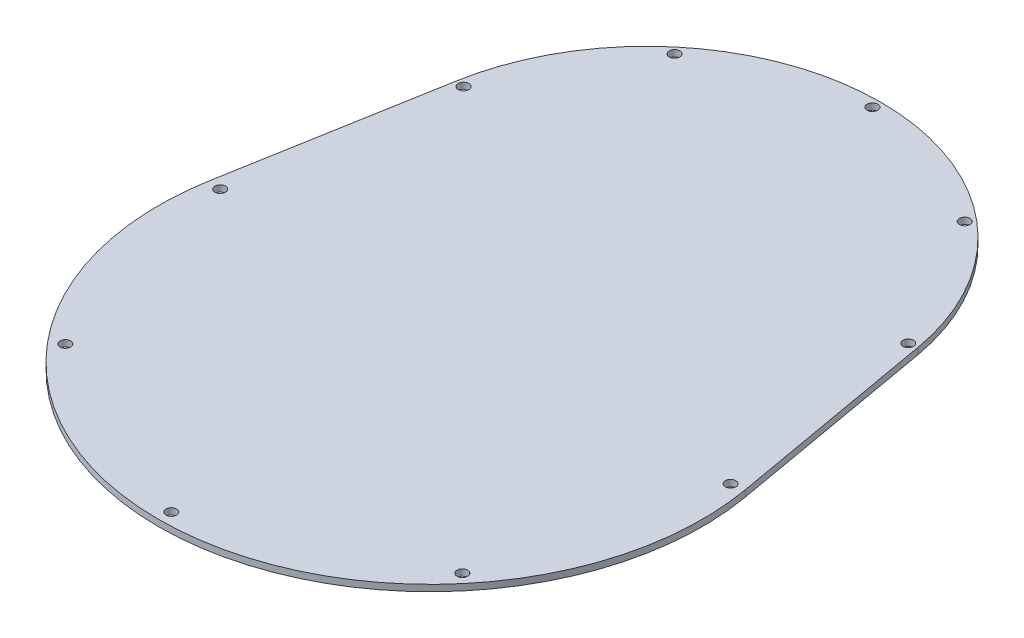
ISO-10303-21;
HEADER;
FILE_DESCRIPTION(('STEP AP214'),'2;1');
FILE_NAME('part.step','',(''),(''),'','','');
FILE_SCHEMA(('AUTOMOTIVE_DESIGN { 1 0 10303 214 1 1 1 1 }'));
ENDSEC;
DATA;
#1=APPLICATION_CONTEXT('core data for automotive mechanical design processes');
#2=APPLICATION_PROTOCOL_DEFINITION('international standard','automotive_design',2000,#1);
#3=PRODUCT_CONTEXT('',#1,'mechanical');
#4=PRODUCT('Part','Part','',(#3));
#5=PRODUCT_RELATED_PRODUCT_CATEGORY('part','',(#4));
#6=PRODUCT_DEFINITION_FORMATION('','',#4);
#7=PRODUCT_DEFINITION_CONTEXT('part definition',#1,'design');
#8=PRODUCT_DEFINITION('design','',#6,#7);
#9=PRODUCT_DEFINITION_SHAPE('','',#8);
#10=(LENGTH_UNIT() NAMED_UNIT(*) SI_UNIT(.MILLI.,.METRE.));
#11=(NAMED_UNIT(*) PLANE_ANGLE_UNIT() SI_UNIT($,.RADIAN.));
#12=(NAMED_UNIT(*) SI_UNIT($,.STERADIAN.) SOLID_ANGLE_UNIT());
#13=UNCERTAINTY_MEASURE_WITH_UNIT(LENGTH_MEASURE(1.E-05),#10,'distance_accuracy_value','');
#14=(GEOMETRIC_REPRESENTATION_CONTEXT(3) GLOBAL_UNCERTAINTY_ASSIGNED_CONTEXT((#13)) GLOBAL_UNIT_ASSIGNED_CONTEXT((#10,
#11,#12)) REPRESENTATION_CONTEXT('',''));
#15=CARTESIAN_POINT('',(0.,0.,0.));
#16=DIRECTION('',(0.,0.,1.));
#17=DIRECTION('',(1.,0.,0.));
#18=AXIS2_PLACEMENT_3D('',#15,#16,#17);
#19=CARTESIAN_POINT('',(0.,-3.,101.542661188575));
#20=DIRECTION('',(0.,1.,0.));
#21=DIRECTION('',(0.,0.,1.));
#22=AXIS2_PLACEMENT_3D('',#19,#20,#21);
#23=CYLINDRICAL_SURFACE('',#22,127.632698070846);
#24=CARTESIAN_POINT('',(0.,0.,101.542661188575));
#25=DIRECTION('',(0.,1.,0.));
#26=DIRECTION('',(0.,0.,1.));
#27=AXIS2_PLACEMENT_3D('',#24,#25,#26);
#28=CIRCLE('',#27,127.632698070846);
#29=CARTESIAN_POINT('',(-125.693670598036,0.,79.379475757859));
#30=VERTEX_POINT('',#29);
#31=CARTESIAN_POINT('',(125.693670598036,0.,79.3794757578591));
#32=VERTEX_POINT('',#31);
#33=EDGE_CURVE('E106',#30,#32,#28,.T.);
#34=ORIENTED_EDGE('',*,*,#33,.F.);
#35=DIRECTION('',(0.,1.,0.));
#36=VECTOR('',#35,1.);
#37=CARTESIAN_POINT('',(-125.693670598036,-3.,79.379475757859));
#38=LINE('',#37,#36);
#39=CARTESIAN_POINT('',(-125.693670598036,-3.,79.379475757859));
#40=VERTEX_POINT('',#39);
#41=EDGE_CURVE('E11',#40,#30,#38,.T.);
#42=ORIENTED_EDGE('',*,*,#41,.F.);
#43=CARTESIAN_POINT('',(0.,-3.,101.542661188575));
#44=DIRECTION('',(0.,1.,0.));
#45=DIRECTION('',(0.,0.,1.));
#46=AXIS2_PLACEMENT_3D('',#43,#44,#45);
#47=CIRCLE('',#46,127.632698070846);
#48=CARTESIAN_POINT('',(125.693670598036,-3.,79.3794757578591));
#49=VERTEX_POINT('',#48);
#50=EDGE_CURVE('E99',#40,#49,#47,.T.);
#51=ORIENTED_EDGE('',*,*,#50,.T.);
#52=DIRECTION('',(0.,1.,0.));
#53=VECTOR('',#52,1.);
#54=CARTESIAN_POINT('',(125.693670598036,-3.,79.3794757578591));
#55=LINE('',#54,#53);
#56=EDGE_CURVE('E44',#49,#32,#55,.T.);
#57=ORIENTED_EDGE('',*,*,#56,.T.);
#58=EDGE_LOOP('',(#34,#42,#51,#57));
#59=FACE_BOUND('',#58,.T.);
#60=ADVANCED_FACE('F41',(#59),#23,.T.);
#61=CARTESIAN_POINT('',(-108.328852831343,-3.,-19.101299543362));
#62=DIRECTION('',(-0.984807753012209,0.,-0.173648177666927));
#63=DIRECTION('',(-0.173648177666927,0.,0.984807753012209));
#64=AXIS2_PLACEMENT_3D('',#61,#62,#63);
#65=PLANE('',#64);
#66=DIRECTION('',(-0.173648177666927,0.,0.984807753012209));
#67=VECTOR('',#66,1.);
#68=CARTESIAN_POINT('',(-108.328852831343,0.,-19.101299543362));
#69=LINE('',#68,#67);
#70=CARTESIAN_POINT('',(-108.328852831343,0.,-19.101299543362));
#71=VERTEX_POINT('',#70);
#72=EDGE_CURVE('E101',#71,#30,#69,.T.);
#73=ORIENTED_EDGE('',*,*,#72,.F.);
#74=DIRECTION('',(0.,1.,0.));
#75=VECTOR('',#74,1.);
#76=CARTESIAN_POINT('',(-108.328852831343,-3.,-19.101299543362));
#77=LINE('',#76,#75);
#78=CARTESIAN_POINT('',(-108.328852831343,-3.,-19.101299543362));
#79=VERTEX_POINT('',#78);
#80=EDGE_CURVE('E50',#79,#71,#77,.T.);
#81=ORIENTED_EDGE('',*,*,#80,.F.);
#82=DIRECTION('',(-0.173648177666927,0.,0.984807753012209));
#83=VECTOR('',#82,1.);
#84=CARTESIAN_POINT('',(-108.328852831343,-3.,-19.101299543362));
#85=LINE('',#84,#83);
#86=EDGE_CURVE('E96',#79,#40,#85,.T.);
#87=ORIENTED_EDGE('',*,*,#86,.T.);
#88=ORIENTED_EDGE('',*,*,#41,.T.);
#89=EDGE_LOOP('',(#73,#81,#87,#88));
#90=FACE_BOUND('',#89,.T.);
#91=ADVANCED_FACE('F117',(#90),#65,.T.);
#92=CARTESIAN_POINT('',(0.,-3.,0.));
#93=DIRECTION('',(0.,1.,0.));
#94=DIRECTION('',(0.,0.,1.));
#95=AXIS2_PLACEMENT_3D('',#92,#93,#94);
#96=CYLINDRICAL_SURFACE('',#95,110.);
#97=CARTESIAN_POINT('',(0.,0.,0.));
#98=DIRECTION('',(0.,1.,0.));
#99=DIRECTION('',(0.,0.,1.));
#100=AXIS2_PLACEMENT_3D('',#97,#98,#99);
#101=CIRCLE('',#100,110.);
#102=CARTESIAN_POINT('',(108.328852831343,0.,-19.101299543362));
#103=VERTEX_POINT('',#102);
#104=EDGE_CURVE('E91',#103,#71,#101,.T.);
#105=ORIENTED_EDGE('',*,*,#104,.F.);
#106=DIRECTION('',(0.,1.,0.));
#107=VECTOR('',#106,1.);
#108=CARTESIAN_POINT('',(108.328852831343,-3.,-19.101299543362));
#109=LINE('',#108,#107);
#110=CARTESIAN_POINT('',(108.328852831343,-3.,-19.101299543362));
#111=VERTEX_POINT('',#110);
#112=EDGE_CURVE('E86',#111,#103,#109,.T.);
#113=ORIENTED_EDGE('',*,*,#112,.F.);
#114=CARTESIAN_POINT('',(0.,-3.,0.));
#115=DIRECTION('',(0.,1.,0.));
#116=DIRECTION('',(0.,0.,1.));
#117=AXIS2_PLACEMENT_3D('',#114,#115,#116);
#118=CIRCLE('',#117,110.);
#119=EDGE_CURVE('E89',#111,#79,#118,.T.);
#120=ORIENTED_EDGE('',*,*,#119,.T.);
#121=ORIENTED_EDGE('',*,*,#80,.T.);
#122=EDGE_LOOP('',(#105,#113,#120,#121));
#123=FACE_BOUND('',#122,.T.);
#124=ADVANCED_FACE('F88',(#123),#96,.T.);
#125=CARTESIAN_POINT('',(125.693670598036,-3.,79.3794757578591));
#126=DIRECTION('',(0.984807753012209,0.,-0.173648177666927));
#127=DIRECTION('',(-0.173648177666927,0.,-0.984807753012209));
#128=AXIS2_PLACEMENT_3D('',#125,#126,#127);
#129=PLANE('',#128);
#130=DIRECTION('',(-0.173648177666927,0.,-0.984807753012209));
#131=VECTOR('',#130,1.);
#132=CARTESIAN_POINT('',(125.693670598036,0.,79.3794757578591));
#133=LINE('',#132,#131);
#134=EDGE_CURVE('E109',#32,#103,#133,.T.);
#135=ORIENTED_EDGE('',*,*,#134,.F.);
#136=ORIENTED_EDGE('',*,*,#56,.F.);
#137=DIRECTION('',(-0.173648177666927,0.,-0.984807753012209));
#138=VECTOR('',#137,1.);
#139=CARTESIAN_POINT('',(125.693670598036,-3.,79.3794757578591));
#140=LINE('',#139,#138);
#141=EDGE_CURVE('E95',#49,#111,#140,.T.);
#142=ORIENTED_EDGE('',*,*,#141,.T.);
#143=ORIENTED_EDGE('',*,*,#112,.T.);
#144=EDGE_LOOP('',(#135,#136,#142,#143));
#145=FACE_BOUND('',#144,.T.);
#146=ADVANCED_FACE('F98',(#145),#129,.T.);
#147=CARTESIAN_POINT('',(0.,-3.,101.542661188575));
#148=DIRECTION('',(0.,1.,0.));
#149=DIRECTION('',(0.,0.,1.));
#150=AXIS2_PLACEMENT_3D('',#147,#148,#149);
#151=PLANE('',#150);
#152=CARTESIAN_POINT('',(0.,-3.,-106.));
#153=DIRECTION('',(0.,1.,0.));
#154=DIRECTION('',(0.,0.,1.));
#155=AXIS2_PLACEMENT_3D('',#152,#153,#154);
#156=CIRCLE('',#155,2.5);
#157=CARTESIAN_POINT('',(0.,-3.,-103.5));
#158=VERTEX_POINT('',#157);
#159=EDGE_CURVE('E186',#158,#158,#156,.T.);
#160=ORIENTED_EDGE('',*,*,#159,.T.);
#161=EDGE_LOOP('',(#160));
#162=FACE_BOUND('',#161,.T.);
#163=CARTESIAN_POINT('',(68.1354866267733,-3.,-81.2007109706116));
#164=DIRECTION('',(0.,1.,0.));
#165=DIRECTION('',(0.,0.,1.));
#166=AXIS2_PLACEMENT_3D('',#163,#164,#165);
#167=CIRCLE('',#166,2.5);
#168=CARTESIAN_POINT('',(68.1354866267733,-3.,-78.7007109706116));
#169=VERTEX_POINT('',#168);
#170=EDGE_CURVE('E194',#169,#169,#167,.T.);
#171=ORIENTED_EDGE('',*,*,#170,.T.);
#172=EDGE_LOOP('',(#171));
#173=FACE_BOUND('',#172,.T.);
#174=CARTESIAN_POINT('',(-68.1354866267733,-3.,-81.2007109706116));
#175=DIRECTION('',(0.,1.,0.));
#176=DIRECTION('',(0.,0.,1.));
#177=AXIS2_PLACEMENT_3D('',#174,#175,#176);
#178=CIRCLE('',#177,2.5);
#179=CARTESIAN_POINT('',(-68.1354866267733,-3.,-78.7007109706116));
#180=VERTEX_POINT('',#179);
#181=EDGE_CURVE('E200',#180,#180,#178,.T.);
#182=ORIENTED_EDGE('',*,*,#181,.T.);
#183=EDGE_LOOP('',(#182));
#184=FACE_BOUND('',#183,.T.);
#185=CARTESIAN_POINT('',(-104.389621819294,-3.,-18.4067068326943));
#186=DIRECTION('',(0.,1.,0.));
#187=DIRECTION('',(0.,0.,1.));
#188=AXIS2_PLACEMENT_3D('',#185,#186,#187);
#189=CIRCLE('',#188,2.50000000000001);
#190=CARTESIAN_POINT('',(-104.389621819294,-3.,-15.9067068326943));
#191=VERTEX_POINT('',#190);
#192=EDGE_CURVE('E206',#191,#191,#189,.T.);
#193=ORIENTED_EDGE('',*,*,#192,.T.);
#194=EDGE_LOOP('',(#193));
#195=FACE_BOUND('',#194,.T.);
#196=CARTESIAN_POINT('',(104.389621819294,-3.,-18.4067068326943));
#197=DIRECTION('',(0.,1.,0.));
#198=DIRECTION('',(0.,0.,1.));
#199=AXIS2_PLACEMENT_3D('',#196,#197,#198);
#200=CIRCLE('',#199,2.50000000000001);
#201=CARTESIAN_POINT('',(104.389621819294,-3.,-15.9067068326943));
#202=VERTEX_POINT('',#201);
#203=EDGE_CURVE('E212',#202,#202,#200,.T.);
#204=ORIENTED_EDGE('',*,*,#203,.T.);
#205=EDGE_LOOP('',(#204));
#206=FACE_BOUND('',#205,.T.);
#207=CARTESIAN_POINT('',(-119.81311763668,-3.,80.4163759064302));
#208=DIRECTION('',(0.,1.,0.));
#209=DIRECTION('',(0.,0.,1.));
#210=AXIS2_PLACEMENT_3D('',#207,#208,#209);
#211=CIRCLE('',#210,2.5);
#212=CARTESIAN_POINT('',(-119.81311763668,-3.,82.9163759064302));
#213=VERTEX_POINT('',#212);
#214=EDGE_CURVE('E218',#213,#213,#211,.T.);
#215=ORIENTED_EDGE('',*,*,#214,.T.);
#216=EDGE_LOOP('',(#215));
#217=FACE_BOUND('',#216,.T.);
#218=CARTESIAN_POINT('',(119.81311763668,-3.,80.4163759064302));
#219=DIRECTION('',(0.,1.,0.));
#220=DIRECTION('',(0.,0.,1.));
#221=AXIS2_PLACEMENT_3D('',#218,#219,#220);
#222=CIRCLE('',#221,2.5);
#223=CARTESIAN_POINT('',(119.81311763668,-3.,82.9163759064302));
#224=VERTEX_POINT('',#223);
#225=EDGE_CURVE('E224',#224,#224,#222,.T.);
#226=ORIENTED_EDGE('',*,*,#225,.T.);
#227=EDGE_LOOP('',(#226));
#228=FACE_BOUND('',#227,.T.);
#229=CARTESIAN_POINT('',(93.1980609389064,-3.,179.745119748848));
#230=DIRECTION('',(0.,1.,0.));
#231=DIRECTION('',(0.,0.,1.));
#232=AXIS2_PLACEMENT_3D('',#229,#230,#231);
#233=CIRCLE('',#232,2.50000000000001);
#234=CARTESIAN_POINT('',(93.1980609389064,-3.,182.245119748848));
#235=VERTEX_POINT('',#234);
#236=EDGE_CURVE('E230',#235,#235,#233,.T.);
#237=ORIENTED_EDGE('',*,*,#236,.T.);
#238=EDGE_LOOP('',(#237));
#239=FACE_BOUND('',#238,.T.);
#240=CARTESIAN_POINT('',(-93.1980609389064,-3.,179.745119748848));
#241=DIRECTION('',(0.,1.,0.));
#242=DIRECTION('',(0.,0.,1.));
#243=AXIS2_PLACEMENT_3D('',#240,#241,#242);
#244=CIRCLE('',#243,2.50000000000001);
#245=CARTESIAN_POINT('',(-93.1980609389064,-3.,182.245119748848));
#246=VERTEX_POINT('',#245);
#247=EDGE_CURVE('E236',#246,#246,#244,.T.);
#248=ORIENTED_EDGE('',*,*,#247,.T.);
#249=EDGE_LOOP('',(#248));
#250=FACE_BOUND('',#249,.T.);
#251=CARTESIAN_POINT('',(0.,-3.,223.204089289857));
#252=DIRECTION('',(0.,1.,0.));
#253=DIRECTION('',(0.,0.,1.));
#254=AXIS2_PLACEMENT_3D('',#251,#252,#253);
#255=CIRCLE('',#254,2.5);
#256=CARTESIAN_POINT('',(0.,-3.,225.704089289857));
#257=VERTEX_POINT('',#256);
#258=EDGE_CURVE('E110',#257,#257,#255,.T.);
#259=ORIENTED_EDGE('',*,*,#258,.T.);
#260=EDGE_LOOP('',(#259));
#261=FACE_BOUND('',#260,.T.);
#262=ORIENTED_EDGE('',*,*,#50,.F.);
#263=ORIENTED_EDGE('',*,*,#86,.F.);
#264=ORIENTED_EDGE('',*,*,#119,.F.);
#265=ORIENTED_EDGE('',*,*,#141,.F.);
#266=EDGE_LOOP('',(#262,#263,#264,#265));
#267=FACE_BOUND('',#266,.T.);
#268=ADVANCED_FACE('F94',(#162,#173,#184,#195,#206,#217,#228,#239,#250,#261,#267),#151,.F.);
#269=CARTESIAN_POINT('',(0.,0.,101.542661188575));
#270=DIRECTION('',(0.,1.,0.));
#271=DIRECTION('',(0.,0.,1.));
#272=AXIS2_PLACEMENT_3D('',#269,#270,#271);
#273=PLANE('',#272);
#274=CARTESIAN_POINT('',(0.,0.,-106.));
#275=DIRECTION('',(0.,1.,0.));
#276=DIRECTION('',(0.,0.,1.));
#277=AXIS2_PLACEMENT_3D('',#274,#275,#276);
#278=CIRCLE('',#277,2.5);
#279=CARTESIAN_POINT('',(0.,0.,-103.5));
#280=VERTEX_POINT('',#279);
#281=EDGE_CURVE('E189',#280,#280,#278,.T.);
#282=ORIENTED_EDGE('',*,*,#281,.F.);
#283=EDGE_LOOP('',(#282));
#284=FACE_BOUND('',#283,.T.);
#285=CARTESIAN_POINT('',(68.1354866267733,0.,-81.2007109706116));
#286=DIRECTION('',(0.,1.,0.));
#287=DIRECTION('',(0.,0.,1.));
#288=AXIS2_PLACEMENT_3D('',#285,#286,#287);
#289=CIRCLE('',#288,2.5);
#290=CARTESIAN_POINT('',(68.1354866267733,0.,-78.7007109706116));
#291=VERTEX_POINT('',#290);
#292=EDGE_CURVE('E191',#291,#291,#289,.T.);
#293=ORIENTED_EDGE('',*,*,#292,.F.);
#294=EDGE_LOOP('',(#293));
#295=FACE_BOUND('',#294,.T.);
#296=CARTESIAN_POINT('',(-68.1354866267733,0.,-81.2007109706116));
#297=DIRECTION('',(0.,1.,0.));
#298=DIRECTION('',(0.,0.,1.));
#299=AXIS2_PLACEMENT_3D('',#296,#297,#298);
#300=CIRCLE('',#299,2.5);
#301=CARTESIAN_POINT('',(-68.1354866267733,0.,-78.7007109706116));
#302=VERTEX_POINT('',#301);
#303=EDGE_CURVE('E197',#302,#302,#300,.T.);
#304=ORIENTED_EDGE('',*,*,#303,.F.);
#305=EDGE_LOOP('',(#304));
#306=FACE_BOUND('',#305,.T.);
#307=CARTESIAN_POINT('',(-104.389621819294,0.,-18.4067068326943));
#308=DIRECTION('',(0.,1.,0.));
#309=DIRECTION('',(0.,0.,1.));
#310=AXIS2_PLACEMENT_3D('',#307,#308,#309);
#311=CIRCLE('',#310,2.50000000000001);
#312=CARTESIAN_POINT('',(-104.389621819294,0.,-15.9067068326943));
#313=VERTEX_POINT('',#312);
#314=EDGE_CURVE('E203',#313,#313,#311,.T.);
#315=ORIENTED_EDGE('',*,*,#314,.F.);
#316=EDGE_LOOP('',(#315));
#317=FACE_BOUND('',#316,.T.);
#318=CARTESIAN_POINT('',(104.389621819294,0.,-18.4067068326943));
#319=DIRECTION('',(0.,1.,0.));
#320=DIRECTION('',(0.,0.,1.));
#321=AXIS2_PLACEMENT_3D('',#318,#319,#320);
#322=CIRCLE('',#321,2.50000000000001);
#323=CARTESIAN_POINT('',(104.389621819294,0.,-15.9067068326943));
#324=VERTEX_POINT('',#323);
#325=EDGE_CURVE('E209',#324,#324,#322,.T.);
#326=ORIENTED_EDGE('',*,*,#325,.F.);
#327=EDGE_LOOP('',(#326));
#328=FACE_BOUND('',#327,.T.);
#329=CARTESIAN_POINT('',(-119.81311763668,0.,80.4163759064302));
#330=DIRECTION('',(0.,1.,0.));
#331=DIRECTION('',(0.,0.,1.));
#332=AXIS2_PLACEMENT_3D('',#329,#330,#331);
#333=CIRCLE('',#332,2.5);
#334=CARTESIAN_POINT('',(-119.81311763668,0.,82.9163759064302));
#335=VERTEX_POINT('',#334);
#336=EDGE_CURVE('E215',#335,#335,#333,.T.);
#337=ORIENTED_EDGE('',*,*,#336,.F.);
#338=EDGE_LOOP('',(#337));
#339=FACE_BOUND('',#338,.T.);
#340=CARTESIAN_POINT('',(119.81311763668,0.,80.4163759064302));
#341=DIRECTION('',(0.,1.,0.));
#342=DIRECTION('',(0.,0.,1.));
#343=AXIS2_PLACEMENT_3D('',#340,#341,#342);
#344=CIRCLE('',#343,2.5);
#345=CARTESIAN_POINT('',(119.81311763668,0.,82.9163759064302));
#346=VERTEX_POINT('',#345);
#347=EDGE_CURVE('E221',#346,#346,#344,.T.);
#348=ORIENTED_EDGE('',*,*,#347,.F.);
#349=EDGE_LOOP('',(#348));
#350=FACE_BOUND('',#349,.T.);
#351=CARTESIAN_POINT('',(93.1980609389064,0.,179.745119748848));
#352=DIRECTION('',(0.,1.,0.));
#353=DIRECTION('',(0.,0.,1.));
#354=AXIS2_PLACEMENT_3D('',#351,#352,#353);
#355=CIRCLE('',#354,2.50000000000001);
#356=CARTESIAN_POINT('',(93.1980609389064,0.,182.245119748848));
#357=VERTEX_POINT('',#356);
#358=EDGE_CURVE('E227',#357,#357,#355,.T.);
#359=ORIENTED_EDGE('',*,*,#358,.F.);
#360=EDGE_LOOP('',(#359));
#361=FACE_BOUND('',#360,.T.);
#362=CARTESIAN_POINT('',(-93.1980609389064,0.,179.745119748848));
#363=DIRECTION('',(0.,1.,0.));
#364=DIRECTION('',(0.,0.,1.));
#365=AXIS2_PLACEMENT_3D('',#362,#363,#364);
#366=CIRCLE('',#365,2.50000000000001);
#367=CARTESIAN_POINT('',(-93.1980609389064,0.,182.245119748848));
#368=VERTEX_POINT('',#367);
#369=EDGE_CURVE('E233',#368,#368,#366,.T.);
#370=ORIENTED_EDGE('',*,*,#369,.F.);
#371=EDGE_LOOP('',(#370));
#372=FACE_BOUND('',#371,.T.);
#373=CARTESIAN_POINT('',(0.,0.,223.204089289857));
#374=DIRECTION('',(0.,1.,0.));
#375=DIRECTION('',(0.,0.,1.));
#376=AXIS2_PLACEMENT_3D('',#373,#374,#375);
#377=CIRCLE('',#376,2.5);
#378=CARTESIAN_POINT('',(0.,0.,225.704089289857));
#379=VERTEX_POINT('',#378);
#380=EDGE_CURVE('E239',#379,#379,#377,.T.);
#381=ORIENTED_EDGE('',*,*,#380,.F.);
#382=EDGE_LOOP('',(#381));
#383=FACE_BOUND('',#382,.T.);
#384=ORIENTED_EDGE('',*,*,#33,.T.);
#385=ORIENTED_EDGE('',*,*,#134,.T.);
#386=ORIENTED_EDGE('',*,*,#104,.T.);
#387=ORIENTED_EDGE('',*,*,#72,.T.);
#388=EDGE_LOOP('',(#384,#385,#386,#387));
#389=FACE_BOUND('',#388,.T.);
#390=ADVANCED_FACE('F116',(#284,#295,#306,#317,#328,#339,#350,#361,#372,#383,#389),#273,.T.);
#391=CARTESIAN_POINT('',(0.,-3.,223.204089289857));
#392=DIRECTION('',(0.,1.,0.));
#393=DIRECTION('',(0.,0.,1.));
#394=AXIS2_PLACEMENT_3D('',#391,#392,#393);
#395=CYLINDRICAL_SURFACE('',#394,2.5);
#396=ORIENTED_EDGE('',*,*,#380,.T.);
#397=EDGE_LOOP('',(#396));
#398=FACE_BOUND('',#397,.T.);
#399=ORIENTED_EDGE('',*,*,#258,.F.);
#400=EDGE_LOOP('',(#399));
#401=FACE_BOUND('',#400,.T.);
#402=ADVANCED_FACE('F138',(#398,#401),#395,.F.);
#403=CARTESIAN_POINT('',(-93.1980609389064,-3.,179.745119748848));
#404=DIRECTION('',(0.,1.,0.));
#405=DIRECTION('',(0.,0.,1.));
#406=AXIS2_PLACEMENT_3D('',#403,#404,#405);
#407=CYLINDRICAL_SURFACE('',#406,2.50000000000001);
#408=ORIENTED_EDGE('',*,*,#247,.F.);
#409=EDGE_LOOP('',(#408));
#410=FACE_BOUND('',#409,.T.);
#411=ORIENTED_EDGE('',*,*,#369,.T.);
#412=EDGE_LOOP('',(#411));
#413=FACE_BOUND('',#412,.T.);
#414=ADVANCED_FACE('F145',(#410,#413),#407,.F.);
#415=CARTESIAN_POINT('',(93.1980609389064,-3.,179.745119748848));
#416=DIRECTION('',(0.,1.,0.));
#417=DIRECTION('',(0.,0.,1.));
#418=AXIS2_PLACEMENT_3D('',#415,#416,#417);
#419=CYLINDRICAL_SURFACE('',#418,2.50000000000001);
#420=ORIENTED_EDGE('',*,*,#236,.F.);
#421=EDGE_LOOP('',(#420));
#422=FACE_BOUND('',#421,.T.);
#423=ORIENTED_EDGE('',*,*,#358,.T.);
#424=EDGE_LOOP('',(#423));
#425=FACE_BOUND('',#424,.T.);
#426=ADVANCED_FACE('F149',(#422,#425),#419,.F.);
#427=CARTESIAN_POINT('',(119.81311763668,-3.,80.4163759064302));
#428=DIRECTION('',(0.,1.,0.));
#429=DIRECTION('',(0.,0.,1.));
#430=AXIS2_PLACEMENT_3D('',#427,#428,#429);
#431=CYLINDRICAL_SURFACE('',#430,2.5);
#432=ORIENTED_EDGE('',*,*,#225,.F.);
#433=EDGE_LOOP('',(#432));
#434=FACE_BOUND('',#433,.T.);
#435=ORIENTED_EDGE('',*,*,#347,.T.);
#436=EDGE_LOOP('',(#435));
#437=FACE_BOUND('',#436,.T.);
#438=ADVANCED_FACE('F153',(#434,#437),#431,.F.);
#439=CARTESIAN_POINT('',(-119.81311763668,-3.,80.4163759064302));
#440=DIRECTION('',(0.,1.,0.));
#441=DIRECTION('',(0.,0.,1.));
#442=AXIS2_PLACEMENT_3D('',#439,#440,#441);
#443=CYLINDRICAL_SURFACE('',#442,2.5);
#444=ORIENTED_EDGE('',*,*,#214,.F.);
#445=EDGE_LOOP('',(#444));
#446=FACE_BOUND('',#445,.T.);
#447=ORIENTED_EDGE('',*,*,#336,.T.);
#448=EDGE_LOOP('',(#447));
#449=FACE_BOUND('',#448,.T.);
#450=ADVANCED_FACE('F157',(#446,#449),#443,.F.);
#451=CARTESIAN_POINT('',(104.389621819294,-3.,-18.4067068326943));
#452=DIRECTION('',(0.,1.,0.));
#453=DIRECTION('',(0.,0.,1.));
#454=AXIS2_PLACEMENT_3D('',#451,#452,#453);
#455=CYLINDRICAL_SURFACE('',#454,2.50000000000001);
#456=ORIENTED_EDGE('',*,*,#203,.F.);
#457=EDGE_LOOP('',(#456));
#458=FACE_BOUND('',#457,.T.);
#459=ORIENTED_EDGE('',*,*,#325,.T.);
#460=EDGE_LOOP('',(#459));
#461=FACE_BOUND('',#460,.T.);
#462=ADVANCED_FACE('F161',(#458,#461),#455,.F.);
#463=CARTESIAN_POINT('',(-104.389621819294,-3.,-18.4067068326943));
#464=DIRECTION('',(0.,1.,0.));
#465=DIRECTION('',(0.,0.,1.));
#466=AXIS2_PLACEMENT_3D('',#463,#464,#465);
#467=CYLINDRICAL_SURFACE('',#466,2.50000000000001);
#468=ORIENTED_EDGE('',*,*,#192,.F.);
#469=EDGE_LOOP('',(#468));
#470=FACE_BOUND('',#469,.T.);
#471=ORIENTED_EDGE('',*,*,#314,.T.);
#472=EDGE_LOOP('',(#471));
#473=FACE_BOUND('',#472,.T.);
#474=ADVANCED_FACE('F165',(#470,#473),#467,.F.);
#475=CARTESIAN_POINT('',(-68.1354866267733,-3.,-81.2007109706116));
#476=DIRECTION('',(0.,1.,0.));
#477=DIRECTION('',(0.,0.,1.));
#478=AXIS2_PLACEMENT_3D('',#475,#476,#477);
#479=CYLINDRICAL_SURFACE('',#478,2.5);
#480=ORIENTED_EDGE('',*,*,#181,.F.);
#481=EDGE_LOOP('',(#480));
#482=FACE_BOUND('',#481,.T.);
#483=ORIENTED_EDGE('',*,*,#303,.T.);
#484=EDGE_LOOP('',(#483));
#485=FACE_BOUND('',#484,.T.);
#486=ADVANCED_FACE('F169',(#482,#485),#479,.F.);
#487=CARTESIAN_POINT('',(68.1354866267733,-3.,-81.2007109706116));
#488=DIRECTION('',(0.,1.,0.));
#489=DIRECTION('',(0.,0.,1.));
#490=AXIS2_PLACEMENT_3D('',#487,#488,#489);
#491=CYLINDRICAL_SURFACE('',#490,2.5);
#492=ORIENTED_EDGE('',*,*,#170,.F.);
#493=EDGE_LOOP('',(#492));
#494=FACE_BOUND('',#493,.T.);
#495=ORIENTED_EDGE('',*,*,#292,.T.);
#496=EDGE_LOOP('',(#495));
#497=FACE_BOUND('',#496,.T.);
#498=ADVANCED_FACE('F173',(#494,#497),#491,.F.);
#499=CARTESIAN_POINT('',(0.,-3.,-106.));
#500=DIRECTION('',(0.,1.,0.));
#501=DIRECTION('',(0.,0.,1.));
#502=AXIS2_PLACEMENT_3D('',#499,#500,#501);
#503=CYLINDRICAL_SURFACE('',#502,2.5);
#504=ORIENTED_EDGE('',*,*,#159,.F.);
#505=EDGE_LOOP('',(#504));
#506=FACE_BOUND('',#505,.T.);
#507=ORIENTED_EDGE('',*,*,#281,.T.);
#508=EDGE_LOOP('',(#507));
#509=FACE_BOUND('',#508,.T.);
#510=ADVANCED_FACE('F177',(#506,#509),#503,.F.);
#511=CLOSED_SHELL('',(#60,#91,#124,#146,#268,#390,#402,#414,#426,#438,#450,#462,#474,#486,#498,#510));
#512=MANIFOLD_SOLID_BREP('B2',#511);
#513=ADVANCED_BREP_SHAPE_REPRESENTATION('',(#18,#512),#14);
#514=SHAPE_DEFINITION_REPRESENTATION(#9,#513);
ENDSEC;
END-ISO-10303-21;
